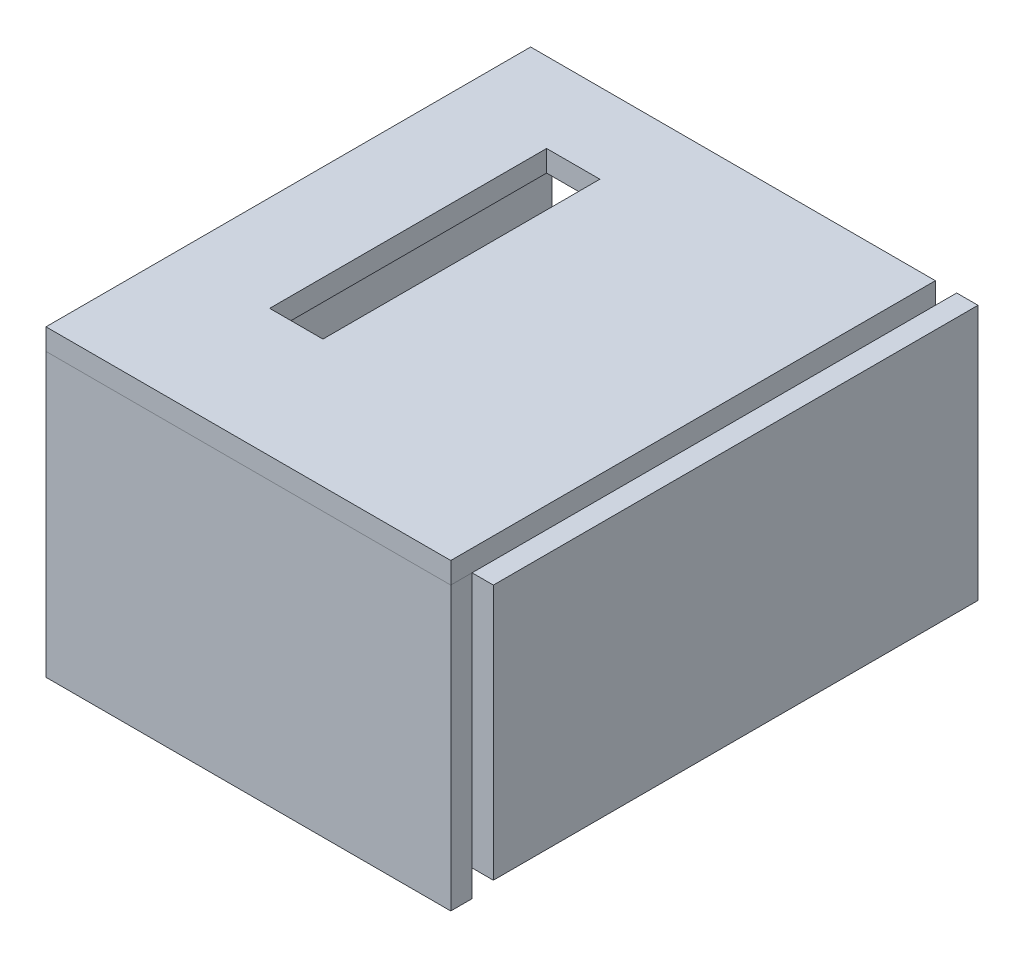
ISO-10303-21;
HEADER;
FILE_DESCRIPTION(('STEP AP214'),'2;1');
FILE_NAME('part.step','',(''),(''),'','','');
FILE_SCHEMA(('AUTOMOTIVE_DESIGN { 1 0 10303 214 1 1 1 1 }'));
ENDSEC;
DATA;
#1=APPLICATION_CONTEXT('core data for automotive mechanical design processes');
#2=APPLICATION_PROTOCOL_DEFINITION('international standard','automotive_design',2000,#1);
#3=PRODUCT_CONTEXT('',#1,'mechanical');
#4=PRODUCT('Part','Part','',(#3));
#5=PRODUCT_RELATED_PRODUCT_CATEGORY('part','',(#4));
#6=PRODUCT_DEFINITION_FORMATION('','',#4);
#7=PRODUCT_DEFINITION_CONTEXT('part definition',#1,'design');
#8=PRODUCT_DEFINITION('design','',#6,#7);
#9=PRODUCT_DEFINITION_SHAPE('','',#8);
#10=(LENGTH_UNIT() NAMED_UNIT(*) SI_UNIT(.MILLI.,.METRE.));
#11=(NAMED_UNIT(*) PLANE_ANGLE_UNIT() SI_UNIT($,.RADIAN.));
#12=(NAMED_UNIT(*) SI_UNIT($,.STERADIAN.) SOLID_ANGLE_UNIT());
#13=UNCERTAINTY_MEASURE_WITH_UNIT(LENGTH_MEASURE(1.E-05),#10,'distance_accuracy_value','');
#14=(GEOMETRIC_REPRESENTATION_CONTEXT(3) GLOBAL_UNCERTAINTY_ASSIGNED_CONTEXT((#13)) GLOBAL_UNIT_ASSIGNED_CONTEXT((#10,
#11,#12)) REPRESENTATION_CONTEXT('',''));
#15=CARTESIAN_POINT('',(0.,0.,0.));
#16=DIRECTION('',(0.,0.,1.));
#17=DIRECTION('',(1.,0.,0.));
#18=AXIS2_PLACEMENT_3D('',#15,#16,#17);
#19=CARTESIAN_POINT('',(-133.35,0.,-157.1625));
#20=DIRECTION('',(0.,0.,1.));
#21=DIRECTION('',(1.,0.,0.));
#22=AXIS2_PLACEMENT_3D('',#19,#20,#21);
#23=PLANE('',#22);
#24=DIRECTION('',(0.,-1.,0.));
#25=VECTOR('',#24,1.);
#26=CARTESIAN_POINT('',(-120.65,0.,-157.1625));
#27=LINE('',#26,#25);
#28=CARTESIAN_POINT('',(-120.65,0.,-157.1625));
#29=VERTEX_POINT('',#28);
#30=CARTESIAN_POINT('',(-120.65,-152.4,-157.1625));
#31=VERTEX_POINT('',#30);
#32=EDGE_CURVE('E119',#29,#31,#27,.T.);
#33=ORIENTED_EDGE('',*,*,#32,.T.);
#34=DIRECTION('',(1.,0.,0.));
#35=VECTOR('',#34,1.);
#36=CARTESIAN_POINT('',(-133.35,-152.4,-157.1625));
#37=LINE('',#36,#35);
#38=CARTESIAN_POINT('',(-133.35,-152.4,-157.1625));
#39=VERTEX_POINT('',#38);
#40=EDGE_CURVE('E12',#39,#31,#37,.T.);
#41=ORIENTED_EDGE('',*,*,#40,.F.);
#42=DIRECTION('',(0.,-1.,0.));
#43=VECTOR('',#42,1.);
#44=CARTESIAN_POINT('',(-133.35,0.,-157.1625));
#45=LINE('',#44,#43);
#46=CARTESIAN_POINT('',(-133.35,0.,-157.1625));
#47=VERTEX_POINT('',#46);
#48=EDGE_CURVE('E107',#47,#39,#45,.T.);
#49=ORIENTED_EDGE('',*,*,#48,.F.);
#50=DIRECTION('',(1.,0.,0.));
#51=VECTOR('',#50,1.);
#52=CARTESIAN_POINT('',(-133.35,0.,-157.1625));
#53=LINE('',#52,#51);
#54=EDGE_CURVE('E115',#47,#29,#53,.T.);
#55=ORIENTED_EDGE('',*,*,#54,.T.);
#56=EDGE_LOOP('',(#33,#41,#49,#55));
#57=FACE_BOUND('',#56,.T.);
#58=ADVANCED_FACE('F56',(#57),#23,.F.);
#59=CARTESIAN_POINT('',(-133.35,-152.4,-157.1625));
#60=DIRECTION('',(0.,1.,0.));
#61=DIRECTION('',(0.,0.,1.));
#62=AXIS2_PLACEMENT_3D('',#59,#60,#61);
#63=PLANE('',#62);
#64=DIRECTION('',(0.,0.,1.));
#65=VECTOR('',#64,1.);
#66=CARTESIAN_POINT('',(-120.65,-152.4,-157.1625));
#67=LINE('',#66,#65);
#68=CARTESIAN_POINT('',(-120.65,-152.4,131.7625));
#69=VERTEX_POINT('',#68);
#70=EDGE_CURVE('E111',#31,#69,#67,.T.);
#71=ORIENTED_EDGE('',*,*,#70,.T.);
#72=DIRECTION('',(1.,0.,0.));
#73=VECTOR('',#72,1.);
#74=CARTESIAN_POINT('',(-133.35,-152.4,131.7625));
#75=LINE('',#74,#73);
#76=CARTESIAN_POINT('',(-133.35,-152.4,131.7625));
#77=VERTEX_POINT('',#76);
#78=EDGE_CURVE('E64',#77,#69,#75,.T.);
#79=ORIENTED_EDGE('',*,*,#78,.F.);
#80=DIRECTION('',(0.,0.,1.));
#81=VECTOR('',#80,1.);
#82=CARTESIAN_POINT('',(-133.35,-152.4,-157.1625));
#83=LINE('',#82,#81);
#84=EDGE_CURVE('E102',#39,#77,#83,.T.);
#85=ORIENTED_EDGE('',*,*,#84,.F.);
#86=ORIENTED_EDGE('',*,*,#40,.T.);
#87=EDGE_LOOP('',(#71,#79,#85,#86));
#88=FACE_BOUND('',#87,.T.);
#89=ADVANCED_FACE('F110',(#88),#63,.F.);
#90=CARTESIAN_POINT('',(-133.35,0.,131.7625));
#91=DIRECTION('',(0.,0.,-1.));
#92=DIRECTION('',(-1.,0.,0.));
#93=AXIS2_PLACEMENT_3D('',#90,#91,#92);
#94=PLANE('',#93);
#95=DIRECTION('',(0.,1.,0.));
#96=VECTOR('',#95,1.);
#97=CARTESIAN_POINT('',(-120.65,0.,131.7625));
#98=LINE('',#97,#96);
#99=CARTESIAN_POINT('',(-120.65,0.,131.7625));
#100=VERTEX_POINT('',#99);
#101=EDGE_CURVE('E89',#69,#100,#98,.T.);
#102=ORIENTED_EDGE('',*,*,#101,.T.);
#103=DIRECTION('',(1.,0.,0.));
#104=VECTOR('',#103,1.);
#105=CARTESIAN_POINT('',(-133.35,0.,131.7625));
#106=LINE('',#105,#104);
#107=CARTESIAN_POINT('',(-133.35,0.,131.7625));
#108=VERTEX_POINT('',#107);
#109=EDGE_CURVE('E112',#108,#100,#106,.T.);
#110=ORIENTED_EDGE('',*,*,#109,.F.);
#111=DIRECTION('',(0.,1.,0.));
#112=VECTOR('',#111,1.);
#113=CARTESIAN_POINT('',(-133.35,0.,131.7625));
#114=LINE('',#113,#112);
#115=EDGE_CURVE('E105',#77,#108,#114,.T.);
#116=ORIENTED_EDGE('',*,*,#115,.F.);
#117=ORIENTED_EDGE('',*,*,#78,.T.);
#118=EDGE_LOOP('',(#102,#110,#116,#117));
#119=FACE_BOUND('',#118,.T.);
#120=ADVANCED_FACE('F113',(#119),#94,.F.);
#121=CARTESIAN_POINT('',(-133.35,0.,-157.1625));
#122=DIRECTION('',(0.,-1.,0.));
#123=DIRECTION('',(0.,0.,-1.));
#124=AXIS2_PLACEMENT_3D('',#121,#122,#123);
#125=PLANE('',#124);
#126=DIRECTION('',(0.,0.,-1.));
#127=VECTOR('',#126,1.);
#128=CARTESIAN_POINT('',(-120.65,0.,-157.1625));
#129=LINE('',#128,#127);
#130=EDGE_CURVE('E95',#100,#29,#129,.T.);
#131=ORIENTED_EDGE('',*,*,#130,.T.);
#132=ORIENTED_EDGE('',*,*,#54,.F.);
#133=DIRECTION('',(0.,0.,-1.));
#134=VECTOR('',#133,1.);
#135=CARTESIAN_POINT('',(-133.35,0.,-157.1625));
#136=LINE('',#135,#134);
#137=EDGE_CURVE('E72',#108,#47,#136,.T.);
#138=ORIENTED_EDGE('',*,*,#137,.F.);
#139=ORIENTED_EDGE('',*,*,#109,.T.);
#140=EDGE_LOOP('',(#131,#132,#138,#139));
#141=FACE_BOUND('',#140,.T.);
#142=ADVANCED_FACE('F126',(#141),#125,.F.);
#143=CARTESIAN_POINT('',(-133.35,0.,0.));
#144=DIRECTION('',(-1.,0.,0.));
#145=DIRECTION('',(0.,0.,1.));
#146=AXIS2_PLACEMENT_3D('',#143,#144,#145);
#147=PLANE('',#146);
#148=ORIENTED_EDGE('',*,*,#48,.T.);
#149=ORIENTED_EDGE('',*,*,#84,.T.);
#150=ORIENTED_EDGE('',*,*,#115,.T.);
#151=ORIENTED_EDGE('',*,*,#137,.T.);
#152=EDGE_LOOP('',(#148,#149,#150,#151));
#153=FACE_BOUND('',#152,.T.);
#154=ADVANCED_FACE('F103',(#153),#147,.T.);
#155=CARTESIAN_POINT('',(-120.65,0.,0.));
#156=DIRECTION('',(-1.,0.,0.));
#157=DIRECTION('',(0.,0.,1.));
#158=AXIS2_PLACEMENT_3D('',#155,#156,#157);
#159=PLANE('',#158);
#160=ORIENTED_EDGE('',*,*,#32,.F.);
#161=ORIENTED_EDGE('',*,*,#130,.F.);
#162=ORIENTED_EDGE('',*,*,#101,.F.);
#163=ORIENTED_EDGE('',*,*,#70,.F.);
#164=EDGE_LOOP('',(#160,#161,#162,#163));
#165=FACE_BOUND('',#164,.T.);
#166=ADVANCED_FACE('F129',(#165),#159,.F.);
#167=CLOSED_SHELL('',(#58,#89,#120,#142,#154,#166));
#168=MANIFOLD_SOLID_BREP('B2',#167);
#169=CARTESIAN_POINT('',(133.35,0.,131.7625));
#170=DIRECTION('',(0.,0.,-1.));
#171=DIRECTION('',(0.,1.,0.));
#172=AXIS2_PLACEMENT_3D('',#169,#170,#171);
#173=PLANE('',#172);
#174=DIRECTION('',(0.,-1.,0.));
#175=VECTOR('',#174,1.);
#176=CARTESIAN_POINT('',(120.65,0.,131.7625));
#177=LINE('',#176,#175);
#178=CARTESIAN_POINT('',(120.65,0.,131.7625));
#179=VERTEX_POINT('',#178);
#180=CARTESIAN_POINT('',(120.65,-152.4,131.7625));
#181=VERTEX_POINT('',#180);
#182=EDGE_CURVE('E253',#179,#181,#177,.T.);
#183=ORIENTED_EDGE('',*,*,#182,.T.);
#184=DIRECTION('',(-1.,0.,0.));
#185=VECTOR('',#184,1.);
#186=CARTESIAN_POINT('',(133.35,-152.4,131.7625));
#187=LINE('',#186,#185);
#188=CARTESIAN_POINT('',(133.35,-152.4,131.7625));
#189=VERTEX_POINT('',#188);
#190=EDGE_CURVE('E54',#189,#181,#187,.T.);
#191=ORIENTED_EDGE('',*,*,#190,.F.);
#192=DIRECTION('',(0.,-1.,0.));
#193=VECTOR('',#192,1.);
#194=CARTESIAN_POINT('',(133.35,0.,131.7625));
#195=LINE('',#194,#193);
#196=CARTESIAN_POINT('',(133.35,0.,131.7625));
#197=VERTEX_POINT('',#196);
#198=EDGE_CURVE('E241',#197,#189,#195,.T.);
#199=ORIENTED_EDGE('',*,*,#198,.F.);
#200=DIRECTION('',(-1.,0.,0.));
#201=VECTOR('',#200,1.);
#202=CARTESIAN_POINT('',(133.35,0.,131.7625));
#203=LINE('',#202,#201);
#204=EDGE_CURVE('E249',#197,#179,#203,.T.);
#205=ORIENTED_EDGE('',*,*,#204,.T.);
#206=EDGE_LOOP('',(#183,#191,#199,#205));
#207=FACE_BOUND('',#206,.T.);
#208=ADVANCED_FACE('F190',(#207),#173,.F.);
#209=CARTESIAN_POINT('',(133.35,-152.4,131.7625));
#210=DIRECTION('',(0.,1.,0.));
#211=DIRECTION('',(0.,0.,1.));
#212=AXIS2_PLACEMENT_3D('',#209,#210,#211);
#213=PLANE('',#212);
#214=DIRECTION('',(0.,0.,-1.));
#215=VECTOR('',#214,1.);
#216=CARTESIAN_POINT('',(120.65,-152.4,131.7625));
#217=LINE('',#216,#215);
#218=CARTESIAN_POINT('',(120.65,-152.4,-157.1625));
#219=VERTEX_POINT('',#218);
#220=EDGE_CURVE('E245',#181,#219,#217,.T.);
#221=ORIENTED_EDGE('',*,*,#220,.T.);
#222=DIRECTION('',(-1.,0.,0.));
#223=VECTOR('',#222,1.);
#224=CARTESIAN_POINT('',(133.35,-152.4,-157.1625));
#225=LINE('',#224,#223);
#226=CARTESIAN_POINT('',(133.35,-152.4,-157.1625));
#227=VERTEX_POINT('',#226);
#228=EDGE_CURVE('E198',#227,#219,#225,.T.);
#229=ORIENTED_EDGE('',*,*,#228,.F.);
#230=DIRECTION('',(0.,0.,-1.));
#231=VECTOR('',#230,1.);
#232=CARTESIAN_POINT('',(133.35,-152.4,131.7625));
#233=LINE('',#232,#231);
#234=EDGE_CURVE('E236',#189,#227,#233,.T.);
#235=ORIENTED_EDGE('',*,*,#234,.F.);
#236=ORIENTED_EDGE('',*,*,#190,.T.);
#237=EDGE_LOOP('',(#221,#229,#235,#236));
#238=FACE_BOUND('',#237,.T.);
#239=ADVANCED_FACE('F244',(#238),#213,.F.);
#240=CARTESIAN_POINT('',(133.35,0.,-157.1625));
#241=DIRECTION('',(0.,0.,1.));
#242=DIRECTION('',(1.,0.,0.));
#243=AXIS2_PLACEMENT_3D('',#240,#241,#242);
#244=PLANE('',#243);
#245=DIRECTION('',(0.,1.,0.));
#246=VECTOR('',#245,1.);
#247=CARTESIAN_POINT('',(120.65,0.,-157.1625));
#248=LINE('',#247,#246);
#249=CARTESIAN_POINT('',(120.65,0.,-157.1625));
#250=VERTEX_POINT('',#249);
#251=EDGE_CURVE('E223',#219,#250,#248,.T.);
#252=ORIENTED_EDGE('',*,*,#251,.T.);
#253=DIRECTION('',(-1.,0.,0.));
#254=VECTOR('',#253,1.);
#255=CARTESIAN_POINT('',(133.35,0.,-157.1625));
#256=LINE('',#255,#254);
#257=CARTESIAN_POINT('',(133.35,0.,-157.1625));
#258=VERTEX_POINT('',#257);
#259=EDGE_CURVE('E246',#258,#250,#256,.T.);
#260=ORIENTED_EDGE('',*,*,#259,.F.);
#261=DIRECTION('',(0.,1.,0.));
#262=VECTOR('',#261,1.);
#263=CARTESIAN_POINT('',(133.35,0.,-157.1625));
#264=LINE('',#263,#262);
#265=EDGE_CURVE('E239',#227,#258,#264,.T.);
#266=ORIENTED_EDGE('',*,*,#265,.F.);
#267=ORIENTED_EDGE('',*,*,#228,.T.);
#268=EDGE_LOOP('',(#252,#260,#266,#267));
#269=FACE_BOUND('',#268,.T.);
#270=ADVANCED_FACE('F247',(#269),#244,.F.);
#271=CARTESIAN_POINT('',(133.35,0.,131.7625));
#272=DIRECTION('',(0.,-1.,0.));
#273=DIRECTION('',(0.,0.,-1.));
#274=AXIS2_PLACEMENT_3D('',#271,#272,#273);
#275=PLANE('',#274);
#276=DIRECTION('',(0.,0.,1.));
#277=VECTOR('',#276,1.);
#278=CARTESIAN_POINT('',(120.65,0.,131.7625));
#279=LINE('',#278,#277);
#280=EDGE_CURVE('E229',#250,#179,#279,.T.);
#281=ORIENTED_EDGE('',*,*,#280,.T.);
#282=ORIENTED_EDGE('',*,*,#204,.F.);
#283=DIRECTION('',(0.,0.,1.));
#284=VECTOR('',#283,1.);
#285=CARTESIAN_POINT('',(133.35,0.,131.7625));
#286=LINE('',#285,#284);
#287=EDGE_CURVE('E206',#258,#197,#286,.T.);
#288=ORIENTED_EDGE('',*,*,#287,.F.);
#289=ORIENTED_EDGE('',*,*,#259,.T.);
#290=EDGE_LOOP('',(#281,#282,#288,#289));
#291=FACE_BOUND('',#290,.T.);
#292=ADVANCED_FACE('F260',(#291),#275,.F.);
#293=CARTESIAN_POINT('',(133.35,0.,0.));
#294=DIRECTION('',(1.,0.,0.));
#295=DIRECTION('',(0.,0.,-1.));
#296=AXIS2_PLACEMENT_3D('',#293,#294,#295);
#297=PLANE('',#296);
#298=ORIENTED_EDGE('',*,*,#198,.T.);
#299=ORIENTED_EDGE('',*,*,#234,.T.);
#300=ORIENTED_EDGE('',*,*,#265,.T.);
#301=ORIENTED_EDGE('',*,*,#287,.T.);
#302=EDGE_LOOP('',(#298,#299,#300,#301));
#303=FACE_BOUND('',#302,.T.);
#304=ADVANCED_FACE('F237',(#303),#297,.T.);
#305=CARTESIAN_POINT('',(120.65,0.,0.));
#306=DIRECTION('',(1.,0.,0.));
#307=DIRECTION('',(0.,0.,-1.));
#308=AXIS2_PLACEMENT_3D('',#305,#306,#307);
#309=PLANE('',#308);
#310=ORIENTED_EDGE('',*,*,#182,.F.);
#311=ORIENTED_EDGE('',*,*,#280,.F.);
#312=ORIENTED_EDGE('',*,*,#251,.F.);
#313=ORIENTED_EDGE('',*,*,#220,.F.);
#314=EDGE_LOOP('',(#310,#311,#312,#313));
#315=FACE_BOUND('',#314,.T.);
#316=ADVANCED_FACE('F263',(#315),#309,.F.);
#317=CLOSED_SHELL('',(#208,#239,#270,#292,#304,#316));
#318=MANIFOLD_SOLID_BREP('B6',#317);
#319=CARTESIAN_POINT('',(-120.65,0.,131.7625));
#320=DIRECTION('',(-1.,0.,0.));
#321=DIRECTION('',(0.,0.,1.));
#322=AXIS2_PLACEMENT_3D('',#319,#320,#321);
#323=PLANE('',#322);
#324=DIRECTION('',(0.,-1.,0.));
#325=VECTOR('',#324,1.);
#326=CARTESIAN_POINT('',(-120.65,0.,144.4625));
#327=LINE('',#326,#325);
#328=CARTESIAN_POINT('',(-120.65,0.,144.4625));
#329=VERTEX_POINT('',#328);
#330=CARTESIAN_POINT('',(-120.65,-168.275,144.4625));
#331=VERTEX_POINT('',#330);
#332=EDGE_CURVE('E387',#329,#331,#327,.T.);
#333=ORIENTED_EDGE('',*,*,#332,.F.);
#334=DIRECTION('',(0.,0.,1.));
#335=VECTOR('',#334,1.);
#336=CARTESIAN_POINT('',(-120.65,0.,131.7625));
#337=LINE('',#336,#335);
#338=CARTESIAN_POINT('',(-120.65,0.,131.7625));
#339=VERTEX_POINT('',#338);
#340=EDGE_CURVE('E188',#339,#329,#337,.T.);
#341=ORIENTED_EDGE('',*,*,#340,.F.);
#342=DIRECTION('',(0.,-1.,0.));
#343=VECTOR('',#342,1.);
#344=CARTESIAN_POINT('',(-120.65,0.,131.7625));
#345=LINE('',#344,#343);
#346=CARTESIAN_POINT('',(-120.65,-168.275,131.7625));
#347=VERTEX_POINT('',#346);
#348=EDGE_CURVE('E381',#339,#347,#345,.T.);
#349=ORIENTED_EDGE('',*,*,#348,.T.);
#350=DIRECTION('',(0.,0.,1.));
#351=VECTOR('',#350,1.);
#352=CARTESIAN_POINT('',(-120.65,-168.275,131.7625));
#353=LINE('',#352,#351);
#354=EDGE_CURVE('E326',#347,#331,#353,.T.);
#355=ORIENTED_EDGE('',*,*,#354,.T.);
#356=EDGE_LOOP('',(#333,#341,#349,#355));
#357=FACE_BOUND('',#356,.T.);
#358=ADVANCED_FACE('F323',(#357),#323,.T.);
#359=CARTESIAN_POINT('',(-120.65,0.,131.7625));
#360=DIRECTION('',(0.,1.,0.));
#361=DIRECTION('',(0.,0.,1.));
#362=AXIS2_PLACEMENT_3D('',#359,#360,#361);
#363=PLANE('',#362);
#364=DIRECTION('',(-1.,0.,0.));
#365=VECTOR('',#364,1.);
#366=CARTESIAN_POINT('',(-120.65,0.,144.4625));
#367=LINE('',#366,#365);
#368=CARTESIAN_POINT('',(120.65,0.,144.4625));
#369=VERTEX_POINT('',#368);
#370=EDGE_CURVE('E383',#369,#329,#367,.T.);
#371=ORIENTED_EDGE('',*,*,#370,.F.);
#372=DIRECTION('',(0.,0.,1.));
#373=VECTOR('',#372,1.);
#374=CARTESIAN_POINT('',(120.65,0.,131.7625));
#375=LINE('',#374,#373);
#376=CARTESIAN_POINT('',(120.65,0.,131.7625));
#377=VERTEX_POINT('',#376);
#378=EDGE_CURVE('E332',#377,#369,#375,.T.);
#379=ORIENTED_EDGE('',*,*,#378,.F.);
#380=DIRECTION('',(-1.,0.,0.));
#381=VECTOR('',#380,1.);
#382=CARTESIAN_POINT('',(-120.65,0.,131.7625));
#383=LINE('',#382,#381);
#384=EDGE_CURVE('E378',#377,#339,#383,.T.);
#385=ORIENTED_EDGE('',*,*,#384,.T.);
#386=ORIENTED_EDGE('',*,*,#340,.T.);
#387=EDGE_LOOP('',(#371,#379,#385,#386));
#388=FACE_BOUND('',#387,.T.);
#389=ADVANCED_FACE('F397',(#388),#363,.T.);
#390=CARTESIAN_POINT('',(120.65,0.,131.7625));
#391=DIRECTION('',(1.,0.,0.));
#392=DIRECTION('',(0.,1.,0.));
#393=AXIS2_PLACEMENT_3D('',#390,#391,#392);
#394=PLANE('',#393);
#395=DIRECTION('',(0.,1.,0.));
#396=VECTOR('',#395,1.);
#397=CARTESIAN_POINT('',(120.65,0.,144.4625));
#398=LINE('',#397,#396);
#399=CARTESIAN_POINT('',(120.65,-168.275,144.4625));
#400=VERTEX_POINT('',#399);
#401=EDGE_CURVE('E373',#400,#369,#398,.T.);
#402=ORIENTED_EDGE('',*,*,#401,.F.);
#403=DIRECTION('',(0.,0.,1.));
#404=VECTOR('',#403,1.);
#405=CARTESIAN_POINT('',(120.65,-168.275,131.7625));
#406=LINE('',#405,#404);
#407=CARTESIAN_POINT('',(120.65,-168.275,131.7625));
#408=VERTEX_POINT('',#407);
#409=EDGE_CURVE('E368',#408,#400,#406,.T.);
#410=ORIENTED_EDGE('',*,*,#409,.F.);
#411=DIRECTION('',(0.,1.,0.));
#412=VECTOR('',#411,1.);
#413=CARTESIAN_POINT('',(120.65,0.,131.7625));
#414=LINE('',#413,#412);
#415=EDGE_CURVE('E371',#408,#377,#414,.T.);
#416=ORIENTED_EDGE('',*,*,#415,.T.);
#417=ORIENTED_EDGE('',*,*,#378,.T.);
#418=EDGE_LOOP('',(#402,#410,#416,#417));
#419=FACE_BOUND('',#418,.T.);
#420=ADVANCED_FACE('F370',(#419),#394,.T.);
#421=CARTESIAN_POINT('',(-120.65,-168.275,131.7625));
#422=DIRECTION('',(0.,-1.,0.));
#423=DIRECTION('',(0.,0.,-1.));
#424=AXIS2_PLACEMENT_3D('',#421,#422,#423);
#425=PLANE('',#424);
#426=DIRECTION('',(1.,0.,0.));
#427=VECTOR('',#426,1.);
#428=CARTESIAN_POINT('',(-120.65,-168.275,144.4625));
#429=LINE('',#428,#427);
#430=EDGE_CURVE('E390',#331,#400,#429,.T.);
#431=ORIENTED_EDGE('',*,*,#430,.F.);
#432=ORIENTED_EDGE('',*,*,#354,.F.);
#433=DIRECTION('',(1.,0.,0.));
#434=VECTOR('',#433,1.);
#435=CARTESIAN_POINT('',(-120.65,-168.275,131.7625));
#436=LINE('',#435,#434);
#437=EDGE_CURVE('E377',#347,#408,#436,.T.);
#438=ORIENTED_EDGE('',*,*,#437,.T.);
#439=ORIENTED_EDGE('',*,*,#409,.T.);
#440=EDGE_LOOP('',(#431,#432,#438,#439));
#441=FACE_BOUND('',#440,.T.);
#442=ADVANCED_FACE('F380',(#441),#425,.T.);
#443=CARTESIAN_POINT('',(0.,0.,131.7625));
#444=DIRECTION('',(0.,0.,1.));
#445=DIRECTION('',(1.,0.,0.));
#446=AXIS2_PLACEMENT_3D('',#443,#444,#445);
#447=PLANE('',#446);
#448=ORIENTED_EDGE('',*,*,#348,.F.);
#449=ORIENTED_EDGE('',*,*,#384,.F.);
#450=ORIENTED_EDGE('',*,*,#415,.F.);
#451=ORIENTED_EDGE('',*,*,#437,.F.);
#452=EDGE_LOOP('',(#448,#449,#450,#451));
#453=FACE_BOUND('',#452,.T.);
#454=ADVANCED_FACE('F376',(#453),#447,.F.);
#455=CARTESIAN_POINT('',(0.,0.,144.4625));
#456=DIRECTION('',(0.,0.,1.));
#457=DIRECTION('',(1.,0.,0.));
#458=AXIS2_PLACEMENT_3D('',#455,#456,#457);
#459=PLANE('',#458);
#460=ORIENTED_EDGE('',*,*,#332,.T.);
#461=ORIENTED_EDGE('',*,*,#430,.T.);
#462=ORIENTED_EDGE('',*,*,#401,.T.);
#463=ORIENTED_EDGE('',*,*,#370,.T.);
#464=EDGE_LOOP('',(#460,#461,#462,#463));
#465=FACE_BOUND('',#464,.T.);
#466=ADVANCED_FACE('F396',(#465),#459,.T.);
#467=CLOSED_SHELL('',(#358,#389,#420,#442,#454,#466));
#468=MANIFOLD_SOLID_BREP('B48',#467);
#469=CARTESIAN_POINT('',(0.,12.7,0.));
#470=DIRECTION('',(0.,1.,0.));
#471=DIRECTION('',(0.,0.,1.));
#472=AXIS2_PLACEMENT_3D('',#469,#470,#471);
#473=PLANE('',#472);
#474=DIRECTION('',(0.,0.,-1.));
#475=VECTOR('',#474,1.);
#476=CARTESIAN_POINT('',(120.65,12.7,-144.4625));
#477=LINE('',#476,#475);
#478=CARTESIAN_POINT('',(120.65,12.7,144.4625));
#479=VERTEX_POINT('',#478);
#480=CARTESIAN_POINT('',(120.65,12.7,-144.4625));
#481=VERTEX_POINT('',#480);
#482=EDGE_CURVE('E561',#479,#481,#477,.T.);
#483=ORIENTED_EDGE('',*,*,#482,.T.);
#484=DIRECTION('',(-1.,0.,0.));
#485=VECTOR('',#484,1.);
#486=CARTESIAN_POINT('',(-120.65,12.7,-144.4625));
#487=LINE('',#486,#485);
#488=CARTESIAN_POINT('',(-120.65,12.7,-144.4625));
#489=VERTEX_POINT('',#488);
#490=EDGE_CURVE('E565',#481,#489,#487,.T.);
#491=ORIENTED_EDGE('',*,*,#490,.T.);
#492=DIRECTION('',(0.,0.,1.));
#493=VECTOR('',#492,1.);
#494=CARTESIAN_POINT('',(-120.65,12.7,-144.4625));
#495=LINE('',#494,#493);
#496=CARTESIAN_POINT('',(-120.65,12.7,144.4625));
#497=VERTEX_POINT('',#496);
#498=EDGE_CURVE('E569',#489,#497,#495,.T.);
#499=ORIENTED_EDGE('',*,*,#498,.T.);
#500=DIRECTION('',(1.,0.,0.));
#501=VECTOR('',#500,1.);
#502=CARTESIAN_POINT('',(-120.65,12.7,144.4625));
#503=LINE('',#502,#501);
#504=EDGE_CURVE('E572',#497,#479,#503,.T.);
#505=ORIENTED_EDGE('',*,*,#504,.T.);
#506=EDGE_LOOP('',(#483,#491,#499,#505));
#507=FACE_BOUND('',#506,.T.);
#508=DIRECTION('',(1.,0.,0.));
#509=VECTOR('',#508,1.);
#510=CARTESIAN_POINT('',(-63.5,12.7,68.2625));
#511=LINE('',#510,#509);
#512=CARTESIAN_POINT('',(-63.5,12.7,68.2625));
#513=VERTEX_POINT('',#512);
#514=CARTESIAN_POINT('',(-31.75,12.7,68.2625));
#515=VERTEX_POINT('',#514);
#516=EDGE_CURVE('E522',#513,#515,#511,.T.);
#517=ORIENTED_EDGE('',*,*,#516,.F.);
#518=DIRECTION('',(0.,0.,1.));
#519=VECTOR('',#518,1.);
#520=CARTESIAN_POINT('',(-63.5,12.7,68.2625));
#521=LINE('',#520,#519);
#522=CARTESIAN_POINT('',(-63.5,12.7,-96.8375));
#523=VERTEX_POINT('',#522);
#524=EDGE_CURVE('E513',#523,#513,#521,.T.);
#525=ORIENTED_EDGE('',*,*,#524,.F.);
#526=DIRECTION('',(-1.,0.,0.));
#527=VECTOR('',#526,1.);
#528=CARTESIAN_POINT('',(-63.5,12.7,-96.8375));
#529=LINE('',#528,#527);
#530=CARTESIAN_POINT('',(-31.75,12.7,-96.8375));
#531=VERTEX_POINT('',#530);
#532=EDGE_CURVE('E539',#531,#523,#529,.T.);
#533=ORIENTED_EDGE('',*,*,#532,.F.);
#534=DIRECTION('',(0.,0.,-1.));
#535=VECTOR('',#534,1.);
#536=CARTESIAN_POINT('',(-31.75,12.7,-96.8375));
#537=LINE('',#536,#535);
#538=EDGE_CURVE('E535',#515,#531,#537,.T.);
#539=ORIENTED_EDGE('',*,*,#538,.F.);
#540=EDGE_LOOP('',(#517,#525,#533,#539));
#541=FACE_BOUND('',#540,.T.);
#542=ADVANCED_FACE('F447',(#507,#541),#473,.T.);
#543=CARTESIAN_POINT('',(0.,0.,0.));
#544=DIRECTION('',(0.,1.,0.));
#545=DIRECTION('',(0.,0.,1.));
#546=AXIS2_PLACEMENT_3D('',#543,#544,#545);
#547=PLANE('',#546);
#548=DIRECTION('',(0.,0.,-1.));
#549=VECTOR('',#548,1.);
#550=CARTESIAN_POINT('',(120.65,0.,-144.4625));
#551=LINE('',#550,#549);
#552=CARTESIAN_POINT('',(120.65,0.,144.4625));
#553=VERTEX_POINT('',#552);
#554=CARTESIAN_POINT('',(120.65,0.,-144.4625));
#555=VERTEX_POINT('',#554);
#556=EDGE_CURVE('E531',#553,#555,#551,.T.);
#557=ORIENTED_EDGE('',*,*,#556,.F.);
#558=DIRECTION('',(1.,0.,0.));
#559=VECTOR('',#558,1.);
#560=CARTESIAN_POINT('',(-120.65,0.,144.4625));
#561=LINE('',#560,#559);
#562=CARTESIAN_POINT('',(-120.65,0.,144.4625));
#563=VERTEX_POINT('',#562);
#564=EDGE_CURVE('E566',#563,#553,#561,.T.);
#565=ORIENTED_EDGE('',*,*,#564,.F.);
#566=DIRECTION('',(0.,0.,1.));
#567=VECTOR('',#566,1.);
#568=CARTESIAN_POINT('',(-120.65,0.,-144.4625));
#569=LINE('',#568,#567);
#570=CARTESIAN_POINT('',(-120.65,0.,-144.4625));
#571=VERTEX_POINT('',#570);
#572=EDGE_CURVE('E582',#571,#563,#569,.T.);
#573=ORIENTED_EDGE('',*,*,#572,.F.);
#574=DIRECTION('',(-1.,0.,0.));
#575=VECTOR('',#574,1.);
#576=CARTESIAN_POINT('',(-120.65,0.,-144.4625));
#577=LINE('',#576,#575);
#578=EDGE_CURVE('E579',#555,#571,#577,.T.);
#579=ORIENTED_EDGE('',*,*,#578,.F.);
#580=EDGE_LOOP('',(#557,#565,#573,#579));
#581=FACE_BOUND('',#580,.T.);
#582=DIRECTION('',(0.,0.,1.));
#583=VECTOR('',#582,1.);
#584=CARTESIAN_POINT('',(-63.5,0.,68.2625));
#585=LINE('',#584,#583);
#586=CARTESIAN_POINT('',(-63.5,0.,-96.8375));
#587=VERTEX_POINT('',#586);
#588=CARTESIAN_POINT('',(-63.5,0.,68.2625));
#589=VERTEX_POINT('',#588);
#590=EDGE_CURVE('E471',#587,#589,#585,.T.);
#591=ORIENTED_EDGE('',*,*,#590,.T.);
#592=DIRECTION('',(1.,0.,0.));
#593=VECTOR('',#592,1.);
#594=CARTESIAN_POINT('',(-63.5,0.,68.2625));
#595=LINE('',#594,#593);
#596=CARTESIAN_POINT('',(-31.75,0.,68.2625));
#597=VERTEX_POINT('',#596);
#598=EDGE_CURVE('E529',#589,#597,#595,.T.);
#599=ORIENTED_EDGE('',*,*,#598,.T.);
#600=DIRECTION('',(0.,0.,-1.));
#601=VECTOR('',#600,1.);
#602=CARTESIAN_POINT('',(-31.75,0.,-96.8375));
#603=LINE('',#602,#601);
#604=CARTESIAN_POINT('',(-31.75,0.,-96.8375));
#605=VERTEX_POINT('',#604);
#606=EDGE_CURVE('E548',#597,#605,#603,.T.);
#607=ORIENTED_EDGE('',*,*,#606,.T.);
#608=DIRECTION('',(-1.,0.,0.));
#609=VECTOR('',#608,1.);
#610=CARTESIAN_POINT('',(-63.5,0.,-96.8375));
#611=LINE('',#610,#609);
#612=EDGE_CURVE('E523',#605,#587,#611,.T.);
#613=ORIENTED_EDGE('',*,*,#612,.T.);
#614=EDGE_LOOP('',(#591,#599,#607,#613));
#615=FACE_BOUND('',#614,.T.);
#616=ADVANCED_FACE('F605',(#581,#615),#547,.F.);
#617=CARTESIAN_POINT('',(120.65,12.7,-144.4625));
#618=DIRECTION('',(-1.,0.,0.));
#619=DIRECTION('',(0.,0.,1.));
#620=AXIS2_PLACEMENT_3D('',#617,#618,#619);
#621=PLANE('',#620);
#622=ORIENTED_EDGE('',*,*,#556,.T.);
#623=DIRECTION('',(0.,-1.,0.));
#624=VECTOR('',#623,1.);
#625=CARTESIAN_POINT('',(120.65,12.7,-144.4625));
#626=LINE('',#625,#624);
#627=EDGE_CURVE('E321',#481,#555,#626,.T.);
#628=ORIENTED_EDGE('',*,*,#627,.F.);
#629=ORIENTED_EDGE('',*,*,#482,.F.);
#630=DIRECTION('',(0.,-1.,0.));
#631=VECTOR('',#630,1.);
#632=CARTESIAN_POINT('',(120.65,12.7,144.4625));
#633=LINE('',#632,#631);
#634=EDGE_CURVE('E575',#479,#553,#633,.T.);
#635=ORIENTED_EDGE('',*,*,#634,.T.);
#636=EDGE_LOOP('',(#622,#628,#629,#635));
#637=FACE_BOUND('',#636,.T.);
#638=ADVANCED_FACE('F449',(#637),#621,.F.);
#639=CARTESIAN_POINT('',(-120.65,12.7,-144.4625));
#640=DIRECTION('',(0.,0.,1.));
#641=DIRECTION('',(1.,0.,0.));
#642=AXIS2_PLACEMENT_3D('',#639,#640,#641);
#643=PLANE('',#642);
#644=ORIENTED_EDGE('',*,*,#578,.T.);
#645=DIRECTION('',(0.,-1.,0.));
#646=VECTOR('',#645,1.);
#647=CARTESIAN_POINT('',(-120.65,12.7,-144.4625));
#648=LINE('',#647,#646);
#649=EDGE_CURVE('E456',#489,#571,#648,.T.);
#650=ORIENTED_EDGE('',*,*,#649,.F.);
#651=ORIENTED_EDGE('',*,*,#490,.F.);
#652=ORIENTED_EDGE('',*,*,#627,.T.);
#653=EDGE_LOOP('',(#644,#650,#651,#652));
#654=FACE_BOUND('',#653,.T.);
#655=ADVANCED_FACE('F615',(#654),#643,.F.);
#656=CARTESIAN_POINT('',(-120.65,12.7,-144.4625));
#657=DIRECTION('',(1.,0.,0.));
#658=DIRECTION('',(0.,0.,-1.));
#659=AXIS2_PLACEMENT_3D('',#656,#657,#658);
#660=PLANE('',#659);
#661=ORIENTED_EDGE('',*,*,#572,.T.);
#662=DIRECTION('',(0.,-1.,0.));
#663=VECTOR('',#662,1.);
#664=CARTESIAN_POINT('',(-120.65,12.7,144.4625));
#665=LINE('',#664,#663);
#666=EDGE_CURVE('E590',#497,#563,#665,.T.);
#667=ORIENTED_EDGE('',*,*,#666,.F.);
#668=ORIENTED_EDGE('',*,*,#498,.F.);
#669=ORIENTED_EDGE('',*,*,#649,.T.);
#670=EDGE_LOOP('',(#661,#667,#668,#669));
#671=FACE_BOUND('',#670,.T.);
#672=ADVANCED_FACE('F599',(#671),#660,.F.);
#673=CARTESIAN_POINT('',(-120.65,12.7,144.4625));
#674=DIRECTION('',(0.,0.,-1.));
#675=DIRECTION('',(-1.,0.,0.));
#676=AXIS2_PLACEMENT_3D('',#673,#674,#675);
#677=PLANE('',#676);
#678=ORIENTED_EDGE('',*,*,#564,.T.);
#679=ORIENTED_EDGE('',*,*,#634,.F.);
#680=ORIENTED_EDGE('',*,*,#504,.F.);
#681=ORIENTED_EDGE('',*,*,#666,.T.);
#682=EDGE_LOOP('',(#678,#679,#680,#681));
#683=FACE_BOUND('',#682,.T.);
#684=ADVANCED_FACE('F609',(#683),#677,.F.);
#685=CARTESIAN_POINT('',(-63.5,12.7,68.2625));
#686=DIRECTION('',(1.,0.,0.));
#687=DIRECTION('',(0.,0.,-1.));
#688=AXIS2_PLACEMENT_3D('',#685,#686,#687);
#689=PLANE('',#688);
#690=ORIENTED_EDGE('',*,*,#590,.F.);
#691=DIRECTION('',(0.,-1.,0.));
#692=VECTOR('',#691,1.);
#693=CARTESIAN_POINT('',(-63.5,12.7,-96.8375));
#694=LINE('',#693,#692);
#695=EDGE_CURVE('E517',#523,#587,#694,.T.);
#696=ORIENTED_EDGE('',*,*,#695,.F.);
#697=ORIENTED_EDGE('',*,*,#524,.T.);
#698=DIRECTION('',(0.,-1.,0.));
#699=VECTOR('',#698,1.);
#700=CARTESIAN_POINT('',(-63.5,12.7,68.2625));
#701=LINE('',#700,#699);
#702=EDGE_CURVE('E516',#513,#589,#701,.T.);
#703=ORIENTED_EDGE('',*,*,#702,.T.);
#704=EDGE_LOOP('',(#690,#696,#697,#703));
#705=FACE_BOUND('',#704,.T.);
#706=ADVANCED_FACE('F515',(#705),#689,.T.);
#707=CARTESIAN_POINT('',(-63.5,12.7,68.2625));
#708=DIRECTION('',(0.,0.,-1.));
#709=DIRECTION('',(-1.,0.,0.));
#710=AXIS2_PLACEMENT_3D('',#707,#708,#709);
#711=PLANE('',#710);
#712=ORIENTED_EDGE('',*,*,#598,.F.);
#713=ORIENTED_EDGE('',*,*,#702,.F.);
#714=ORIENTED_EDGE('',*,*,#516,.T.);
#715=DIRECTION('',(0.,-1.,0.));
#716=VECTOR('',#715,1.);
#717=CARTESIAN_POINT('',(-31.75,12.7,68.2625));
#718=LINE('',#717,#716);
#719=EDGE_CURVE('E532',#515,#597,#718,.T.);
#720=ORIENTED_EDGE('',*,*,#719,.T.);
#721=EDGE_LOOP('',(#712,#713,#714,#720));
#722=FACE_BOUND('',#721,.T.);
#723=ADVANCED_FACE('F526',(#722),#711,.T.);
#724=CARTESIAN_POINT('',(-31.75,12.7,-96.8375));
#725=DIRECTION('',(-1.,0.,0.));
#726=DIRECTION('',(0.,0.,1.));
#727=AXIS2_PLACEMENT_3D('',#724,#725,#726);
#728=PLANE('',#727);
#729=ORIENTED_EDGE('',*,*,#606,.F.);
#730=ORIENTED_EDGE('',*,*,#719,.F.);
#731=ORIENTED_EDGE('',*,*,#538,.T.);
#732=DIRECTION('',(0.,-1.,0.));
#733=VECTOR('',#732,1.);
#734=CARTESIAN_POINT('',(-31.75,12.7,-96.8375));
#735=LINE('',#734,#733);
#736=EDGE_CURVE('E463',#531,#605,#735,.T.);
#737=ORIENTED_EDGE('',*,*,#736,.T.);
#738=EDGE_LOOP('',(#729,#730,#731,#737));
#739=FACE_BOUND('',#738,.T.);
#740=ADVANCED_FACE('F638',(#739),#728,.T.);
#741=CARTESIAN_POINT('',(-63.5,12.7,-96.8375));
#742=DIRECTION('',(0.,0.,1.));
#743=DIRECTION('',(1.,0.,0.));
#744=AXIS2_PLACEMENT_3D('',#741,#742,#743);
#745=PLANE('',#744);
#746=ORIENTED_EDGE('',*,*,#612,.F.);
#747=ORIENTED_EDGE('',*,*,#736,.F.);
#748=ORIENTED_EDGE('',*,*,#532,.T.);
#749=ORIENTED_EDGE('',*,*,#695,.T.);
#750=EDGE_LOOP('',(#746,#747,#748,#749));
#751=FACE_BOUND('',#750,.T.);
#752=ADVANCED_FACE('F642',(#751),#745,.T.);
#753=CLOSED_SHELL('',(#542,#616,#638,#655,#672,#684,#706,#723,#740,#752));
#754=MANIFOLD_SOLID_BREP('B182',#753);
#755=ADVANCED_BREP_SHAPE_REPRESENTATION('',(#18,#168,#318,#468,#754),#14);
#756=SHAPE_DEFINITION_REPRESENTATION(#9,#755);
ENDSEC;
END-ISO-10303-21;
